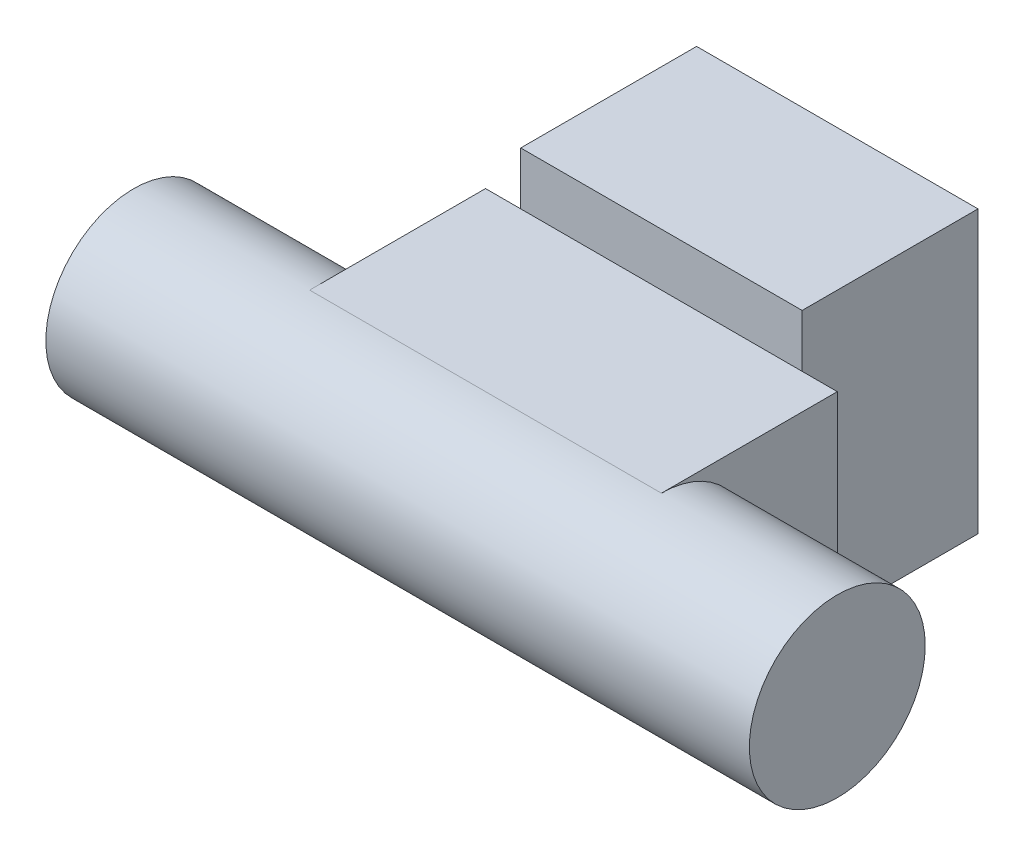
ISO-10303-21;
HEADER;
FILE_DESCRIPTION(('STEP AP214'),'2;1');
FILE_NAME('part.step','',(''),(''),'','','');
FILE_SCHEMA(('AUTOMOTIVE_DESIGN { 1 0 10303 214 1 1 1 1 }'));
ENDSEC;
DATA;
#1=APPLICATION_CONTEXT('core data for automotive mechanical design processes');
#2=APPLICATION_PROTOCOL_DEFINITION('international standard','automotive_design',2000,#1);
#3=PRODUCT_CONTEXT('',#1,'mechanical');
#4=PRODUCT('Part','Part','',(#3));
#5=PRODUCT_RELATED_PRODUCT_CATEGORY('part','',(#4));
#6=PRODUCT_DEFINITION_FORMATION('','',#4);
#7=PRODUCT_DEFINITION_CONTEXT('part definition',#1,'design');
#8=PRODUCT_DEFINITION('design','',#6,#7);
#9=PRODUCT_DEFINITION_SHAPE('','',#8);
#10=(LENGTH_UNIT() NAMED_UNIT(*) SI_UNIT(.MILLI.,.METRE.));
#11=(NAMED_UNIT(*) PLANE_ANGLE_UNIT() SI_UNIT($,.RADIAN.));
#12=(NAMED_UNIT(*) SI_UNIT($,.STERADIAN.) SOLID_ANGLE_UNIT());
#13=UNCERTAINTY_MEASURE_WITH_UNIT(LENGTH_MEASURE(1.E-05),#10,'distance_accuracy_value','');
#14=(GEOMETRIC_REPRESENTATION_CONTEXT(3) GLOBAL_UNCERTAINTY_ASSIGNED_CONTEXT((#13)) GLOBAL_UNIT_ASSIGNED_CONTEXT((#10,
#11,#12)) REPRESENTATION_CONTEXT('',''));
#15=CARTESIAN_POINT('',(0.,0.,0.));
#16=DIRECTION('',(0.,0.,1.));
#17=DIRECTION('',(1.,0.,0.));
#18=AXIS2_PLACEMENT_3D('',#15,#16,#17);
#19=CARTESIAN_POINT('',(0.,0.,0.));
#20=DIRECTION('',(0.,0.,1.));
#21=DIRECTION('',(1.,0.,0.));
#22=AXIS2_PLACEMENT_3D('',#19,#20,#21);
#23=PLANE('',#22);
#24=DIRECTION('',(0.,-1.,0.));
#25=VECTOR('',#24,1.);
#26=CARTESIAN_POINT('',(8.,3.,0.));
#27=LINE('',#26,#25);
#28=CARTESIAN_POINT('',(8.,0.,0.));
#29=VERTEX_POINT('',#28);
#30=CARTESIAN_POINT('',(8.,-10.,0.));
#31=VERTEX_POINT('',#30);
#32=EDGE_CURVE('E11',#29,#31,#27,.T.);
#33=ORIENTED_EDGE('',*,*,#32,.F.);
#34=DIRECTION('',(-1.,0.,0.));
#35=VECTOR('',#34,1.);
#36=CARTESIAN_POINT('',(0.,0.,0.));
#37=LINE('',#36,#35);
#38=CARTESIAN_POINT('',(10.,0.,0.));
#39=VERTEX_POINT('',#38);
#40=EDGE_CURVE('E169',#39,#29,#37,.T.);
#41=ORIENTED_EDGE('',*,*,#40,.F.);
#42=DIRECTION('',(0.,1.,0.));
#43=VECTOR('',#42,1.);
#44=CARTESIAN_POINT('',(10.,0.,0.));
#45=LINE('',#44,#43);
#46=CARTESIAN_POINT('',(10.,-10.,0.));
#47=VERTEX_POINT('',#46);
#48=EDGE_CURVE('E175',#47,#39,#45,.T.);
#49=ORIENTED_EDGE('',*,*,#48,.F.);
#50=DIRECTION('',(1.,0.,0.));
#51=VECTOR('',#50,1.);
#52=CARTESIAN_POINT('',(0.,-10.,0.));
#53=LINE('',#52,#51);
#54=EDGE_CURVE('E57',#31,#47,#53,.T.);
#55=ORIENTED_EDGE('',*,*,#54,.F.);
#56=EDGE_LOOP('',(#33,#41,#49,#55));
#57=FACE_BOUND('',#56,.T.);
#58=ADVANCED_FACE('F35',(#57),#23,.F.);
#59=DIRECTION('',(0.,1.,0.));
#60=VECTOR('',#59,1.);
#61=CARTESIAN_POINT('',(-8.,3.,0.));
#62=LINE('',#61,#60);
#63=CARTESIAN_POINT('',(-8.,-10.,0.));
#64=VERTEX_POINT('',#63);
#65=CARTESIAN_POINT('',(-8.,0.,0.));
#66=VERTEX_POINT('',#65);
#67=EDGE_CURVE('E44',#64,#66,#62,.T.);
#68=ORIENTED_EDGE('',*,*,#67,.F.);
#69=CARTESIAN_POINT('',(-10.,-10.,0.));
#70=VERTEX_POINT('',#69);
#71=EDGE_CURVE('E172',#70,#64,#53,.T.);
#72=ORIENTED_EDGE('',*,*,#71,.F.);
#73=DIRECTION('',(0.,1.,0.));
#74=VECTOR('',#73,1.);
#75=CARTESIAN_POINT('',(-10.,0.,0.));
#76=LINE('',#75,#74);
#77=CARTESIAN_POINT('',(-10.,0.,0.));
#78=VERTEX_POINT('',#77);
#79=EDGE_CURVE('E150',#70,#78,#76,.T.);
#80=ORIENTED_EDGE('',*,*,#79,.T.);
#81=EDGE_CURVE('E178',#66,#78,#37,.T.);
#82=ORIENTED_EDGE('',*,*,#81,.F.);
#83=EDGE_LOOP('',(#68,#72,#80,#82));
#84=FACE_BOUND('',#83,.T.);
#85=ADVANCED_FACE('F250',(#84),#23,.F.);
#86=CARTESIAN_POINT('',(10.,0.,10.));
#87=DIRECTION('',(-1.,0.,0.));
#88=DIRECTION('',(0.,-1.,0.));
#89=AXIS2_PLACEMENT_3D('',#86,#87,#88);
#90=PLANE('',#89);
#91=CARTESIAN_POINT('',(10.,-5.,10.));
#92=DIRECTION('',(-1.,0.,0.));
#93=DIRECTION('',(0.,-1.,0.));
#94=AXIS2_PLACEMENT_3D('',#91,#92,#93);
#95=CIRCLE('',#94,5.);
#96=CARTESIAN_POINT('',(10.,-10.,10.));
#97=VERTEX_POINT('',#96);
#98=CARTESIAN_POINT('',(10.,0.,10.));
#99=VERTEX_POINT('',#98);
#100=EDGE_CURVE('E162',#97,#99,#95,.F.);
#101=ORIENTED_EDGE('',*,*,#100,.F.);
#102=DIRECTION('',(0.,0.,-1.));
#103=VECTOR('',#102,1.);
#104=CARTESIAN_POINT('',(10.,-10.,10.));
#105=LINE('',#104,#103);
#106=EDGE_CURVE('E39',#97,#47,#105,.T.);
#107=ORIENTED_EDGE('',*,*,#106,.T.);
#108=ORIENTED_EDGE('',*,*,#48,.T.);
#109=DIRECTION('',(0.,0.,-1.));
#110=VECTOR('',#109,1.);
#111=CARTESIAN_POINT('',(10.,0.,10.));
#112=LINE('',#111,#110);
#113=EDGE_CURVE('E171',#99,#39,#112,.T.);
#114=ORIENTED_EDGE('',*,*,#113,.F.);
#115=EDGE_LOOP('',(#101,#107,#108,#114));
#116=FACE_BOUND('',#115,.T.);
#117=ADVANCED_FACE('F255',(#116),#90,.F.);
#118=CARTESIAN_POINT('',(0.,-10.,10.));
#119=DIRECTION('',(0.,1.,0.));
#120=DIRECTION('',(0.,0.,1.));
#121=AXIS2_PLACEMENT_3D('',#118,#119,#120);
#122=PLANE('',#121);
#123=ORIENTED_EDGE('',*,*,#71,.T.);
#124=EDGE_CURVE('E176',#64,#31,#53,.T.);
#125=ORIENTED_EDGE('',*,*,#124,.T.);
#126=ORIENTED_EDGE('',*,*,#54,.T.);
#127=ORIENTED_EDGE('',*,*,#106,.F.);
#128=DIRECTION('',(1.,0.,0.));
#129=VECTOR('',#128,1.);
#130=CARTESIAN_POINT('',(0.,-10.,10.));
#131=LINE('',#130,#129);
#132=CARTESIAN_POINT('',(-10.,-10.,10.));
#133=VERTEX_POINT('',#132);
#134=EDGE_CURVE('E165',#133,#97,#131,.T.);
#135=ORIENTED_EDGE('',*,*,#134,.F.);
#136=DIRECTION('',(0.,0.,-1.));
#137=VECTOR('',#136,1.);
#138=CARTESIAN_POINT('',(-10.,-10.,10.));
#139=LINE('',#138,#137);
#140=EDGE_CURVE('E153',#133,#70,#139,.T.);
#141=ORIENTED_EDGE('',*,*,#140,.T.);
#142=EDGE_LOOP('',(#123,#125,#126,#127,#135,#141));
#143=FACE_BOUND('',#142,.T.);
#144=ADVANCED_FACE('F37',(#143),#122,.F.);
#145=CARTESIAN_POINT('',(0.,0.,10.));
#146=DIRECTION('',(0.,-1.,0.));
#147=DIRECTION('',(0.,0.,-1.));
#148=AXIS2_PLACEMENT_3D('',#145,#146,#147);
#149=PLANE('',#148);
#150=ORIENTED_EDGE('',*,*,#40,.T.);
#151=EDGE_CURVE('E179',#29,#66,#37,.T.);
#152=ORIENTED_EDGE('',*,*,#151,.T.);
#153=ORIENTED_EDGE('',*,*,#81,.T.);
#154=DIRECTION('',(0.,0.,-1.));
#155=VECTOR('',#154,1.);
#156=CARTESIAN_POINT('',(-10.,0.,10.));
#157=LINE('',#156,#155);
#158=CARTESIAN_POINT('',(-10.,0.,10.));
#159=VERTEX_POINT('',#158);
#160=EDGE_CURVE('E156',#159,#78,#157,.T.);
#161=ORIENTED_EDGE('',*,*,#160,.F.);
#162=DIRECTION('',(-1.,0.,0.));
#163=VECTOR('',#162,1.);
#164=CARTESIAN_POINT('',(0.,0.,10.));
#165=LINE('',#164,#163);
#166=EDGE_CURVE('E168',#99,#159,#165,.T.);
#167=ORIENTED_EDGE('',*,*,#166,.F.);
#168=ORIENTED_EDGE('',*,*,#113,.T.);
#169=EDGE_LOOP('',(#150,#152,#153,#161,#167,#168));
#170=FACE_BOUND('',#169,.T.);
#171=ADVANCED_FACE('F261',(#170),#149,.F.);
#172=CARTESIAN_POINT('',(20.,-5.,10.));
#173=DIRECTION('',(-1.,0.,0.));
#174=DIRECTION('',(0.,0.,1.));
#175=AXIS2_PLACEMENT_3D('',#172,#173,#174);
#176=CYLINDRICAL_SURFACE('',#175,5.);
#177=ORIENTED_EDGE('',*,*,#166,.T.);
#178=CARTESIAN_POINT('',(-10.,-5.,10.));
#179=DIRECTION('',(-1.,0.,0.));
#180=DIRECTION('',(0.,-1.,0.));
#181=AXIS2_PLACEMENT_3D('',#178,#179,#180);
#182=CIRCLE('',#181,5.);
#183=EDGE_CURVE('E142',#159,#133,#182,.T.);
#184=ORIENTED_EDGE('',*,*,#183,.T.);
#185=ORIENTED_EDGE('',*,*,#134,.T.);
#186=ORIENTED_EDGE('',*,*,#100,.T.);
#187=EDGE_LOOP('',(#177,#184,#185,#186));
#188=FACE_BOUND('',#187,.T.);
#189=CARTESIAN_POINT('',(20.,-5.,10.));
#190=DIRECTION('',(1.,0.,0.));
#191=DIRECTION('',(0.,0.,-1.));
#192=AXIS2_PLACEMENT_3D('',#189,#190,#191);
#193=CIRCLE('',#192,5.);
#194=CARTESIAN_POINT('',(20.,-5.,5.));
#195=VERTEX_POINT('',#194);
#196=EDGE_CURVE('E159',#195,#195,#193,.T.);
#197=ORIENTED_EDGE('',*,*,#196,.F.);
#198=EDGE_LOOP('',(#197));
#199=FACE_BOUND('',#198,.T.);
#200=CARTESIAN_POINT('',(-20.,-5.,10.));
#201=DIRECTION('',(1.,0.,0.));
#202=DIRECTION('',(0.,0.,-1.));
#203=AXIS2_PLACEMENT_3D('',#200,#201,#202);
#204=CIRCLE('',#203,5.);
#205=CARTESIAN_POINT('',(-20.,-5.,5.));
#206=VERTEX_POINT('',#205);
#207=EDGE_CURVE('E139',#206,#206,#204,.T.);
#208=ORIENTED_EDGE('',*,*,#207,.T.);
#209=EDGE_LOOP('',(#208));
#210=FACE_BOUND('',#209,.T.);
#211=ADVANCED_FACE('F259',(#188,#199,#210),#176,.T.);
#212=CARTESIAN_POINT('',(20.,-5.,10.));
#213=DIRECTION('',(1.,0.,0.));
#214=DIRECTION('',(0.,0.,-1.));
#215=AXIS2_PLACEMENT_3D('',#212,#213,#214);
#216=PLANE('',#215);
#217=ORIENTED_EDGE('',*,*,#196,.T.);
#218=EDGE_LOOP('',(#217));
#219=FACE_BOUND('',#218,.T.);
#220=ADVANCED_FACE('F298',(#219),#216,.T.);
#221=CARTESIAN_POINT('',(-10.,0.,10.));
#222=DIRECTION('',(-1.,0.,0.));
#223=DIRECTION('',(0.,-1.,0.));
#224=AXIS2_PLACEMENT_3D('',#221,#222,#223);
#225=PLANE('',#224);
#226=ORIENTED_EDGE('',*,*,#183,.F.);
#227=ORIENTED_EDGE('',*,*,#160,.T.);
#228=ORIENTED_EDGE('',*,*,#79,.F.);
#229=ORIENTED_EDGE('',*,*,#140,.F.);
#230=EDGE_LOOP('',(#226,#227,#228,#229));
#231=FACE_BOUND('',#230,.T.);
#232=ADVANCED_FACE('F275',(#231),#225,.T.);
#233=CARTESIAN_POINT('',(-20.,-5.,10.));
#234=DIRECTION('',(-1.,0.,0.));
#235=DIRECTION('',(0.,0.,-1.));
#236=AXIS2_PLACEMENT_3D('',#233,#234,#235);
#237=PLANE('',#236);
#238=ORIENTED_EDGE('',*,*,#207,.F.);
#239=EDGE_LOOP('',(#238));
#240=FACE_BOUND('',#239,.T.);
#241=ADVANCED_FACE('F293',(#240),#237,.T.);
#242=CARTESIAN_POINT('',(0.,0.,0.));
#243=DIRECTION('',(0.,0.,-1.));
#244=DIRECTION('',(-1.,0.,0.));
#245=AXIS2_PLACEMENT_3D('',#242,#243,#244);
#246=PLANE('',#245);
#247=ORIENTED_EDGE('',*,*,#124,.F.);
#248=CARTESIAN_POINT('',(-8.,-13.,0.));
#249=VERTEX_POINT('',#248);
#250=EDGE_CURVE('E188',#249,#64,#62,.T.);
#251=ORIENTED_EDGE('',*,*,#250,.F.);
#252=DIRECTION('',(-1.,0.,0.));
#253=VECTOR('',#252,1.);
#254=CARTESIAN_POINT('',(8.,-13.,0.));
#255=LINE('',#254,#253);
#256=CARTESIAN_POINT('',(8.,-13.,0.));
#257=VERTEX_POINT('',#256);
#258=EDGE_CURVE('E194',#257,#249,#255,.T.);
#259=ORIENTED_EDGE('',*,*,#258,.F.);
#260=EDGE_CURVE('E47',#31,#257,#27,.T.);
#261=ORIENTED_EDGE('',*,*,#260,.F.);
#262=EDGE_LOOP('',(#247,#251,#259,#261));
#263=FACE_BOUND('',#262,.T.);
#264=ADVANCED_FACE('F245',(#263),#246,.F.);
#265=CARTESIAN_POINT('',(8.,3.,-10.));
#266=DIRECTION('',(-1.,0.,0.));
#267=DIRECTION('',(0.,-1.,0.));
#268=AXIS2_PLACEMENT_3D('',#265,#266,#267);
#269=PLANE('',#268);
#270=CARTESIAN_POINT('',(8.,3.,0.));
#271=VERTEX_POINT('',#270);
#272=EDGE_CURVE('E46',#271,#29,#27,.T.);
#273=ORIENTED_EDGE('',*,*,#272,.T.);
#274=ORIENTED_EDGE('',*,*,#32,.T.);
#275=ORIENTED_EDGE('',*,*,#260,.T.);
#276=DIRECTION('',(0.,0.,1.));
#277=VECTOR('',#276,1.);
#278=CARTESIAN_POINT('',(8.,-13.,-10.));
#279=LINE('',#278,#277);
#280=CARTESIAN_POINT('',(8.,-13.,-10.));
#281=VERTEX_POINT('',#280);
#282=EDGE_CURVE('E118',#281,#257,#279,.T.);
#283=ORIENTED_EDGE('',*,*,#282,.F.);
#284=DIRECTION('',(0.,-1.,0.));
#285=VECTOR('',#284,1.);
#286=CARTESIAN_POINT('',(8.,3.,-10.));
#287=LINE('',#286,#285);
#288=CARTESIAN_POINT('',(8.,3.,-10.));
#289=VERTEX_POINT('',#288);
#290=EDGE_CURVE('E124',#289,#281,#287,.T.);
#291=ORIENTED_EDGE('',*,*,#290,.F.);
#292=DIRECTION('',(0.,0.,1.));
#293=VECTOR('',#292,1.);
#294=CARTESIAN_POINT('',(8.,3.,-10.));
#295=LINE('',#294,#293);
#296=EDGE_CURVE('E200',#289,#271,#295,.T.);
#297=ORIENTED_EDGE('',*,*,#296,.T.);
#298=EDGE_LOOP('',(#273,#274,#275,#283,#291,#297));
#299=FACE_BOUND('',#298,.T.);
#300=ADVANCED_FACE('F136',(#299),#269,.F.);
#301=CARTESIAN_POINT('',(8.,-13.,-10.));
#302=DIRECTION('',(0.,1.,0.));
#303=DIRECTION('',(-1.,0.,0.));
#304=AXIS2_PLACEMENT_3D('',#301,#302,#303);
#305=PLANE('',#304);
#306=ORIENTED_EDGE('',*,*,#258,.T.);
#307=DIRECTION('',(0.,0.,1.));
#308=VECTOR('',#307,1.);
#309=CARTESIAN_POINT('',(-8.,-13.,-10.));
#310=LINE('',#309,#308);
#311=CARTESIAN_POINT('',(-8.,-13.,-10.));
#312=VERTEX_POINT('',#311);
#313=EDGE_CURVE('E120',#312,#249,#310,.T.);
#314=ORIENTED_EDGE('',*,*,#313,.F.);
#315=DIRECTION('',(-1.,0.,0.));
#316=VECTOR('',#315,1.);
#317=CARTESIAN_POINT('',(8.,-13.,-10.));
#318=LINE('',#317,#316);
#319=EDGE_CURVE('E114',#281,#312,#318,.T.);
#320=ORIENTED_EDGE('',*,*,#319,.F.);
#321=ORIENTED_EDGE('',*,*,#282,.T.);
#322=EDGE_LOOP('',(#306,#314,#320,#321));
#323=FACE_BOUND('',#322,.T.);
#324=ADVANCED_FACE('F116',(#323),#305,.F.);
#325=CARTESIAN_POINT('',(-8.,3.,-10.));
#326=DIRECTION('',(1.,0.,0.));
#327=DIRECTION('',(0.,1.,0.));
#328=AXIS2_PLACEMENT_3D('',#325,#326,#327);
#329=PLANE('',#328);
#330=ORIENTED_EDGE('',*,*,#250,.T.);
#331=ORIENTED_EDGE('',*,*,#67,.T.);
#332=CARTESIAN_POINT('',(-8.,3.,0.));
#333=VERTEX_POINT('',#332);
#334=EDGE_CURVE('E189',#66,#333,#62,.T.);
#335=ORIENTED_EDGE('',*,*,#334,.T.);
#336=DIRECTION('',(0.,0.,1.));
#337=VECTOR('',#336,1.);
#338=CARTESIAN_POINT('',(-8.,3.,-10.));
#339=LINE('',#338,#337);
#340=CARTESIAN_POINT('',(-8.,3.,-10.));
#341=VERTEX_POINT('',#340);
#342=EDGE_CURVE('E144',#341,#333,#339,.T.);
#343=ORIENTED_EDGE('',*,*,#342,.F.);
#344=DIRECTION('',(0.,1.,0.));
#345=VECTOR('',#344,1.);
#346=CARTESIAN_POINT('',(-8.,3.,-10.));
#347=LINE('',#346,#345);
#348=EDGE_CURVE('E123',#312,#341,#347,.T.);
#349=ORIENTED_EDGE('',*,*,#348,.F.);
#350=ORIENTED_EDGE('',*,*,#313,.T.);
#351=EDGE_LOOP('',(#330,#331,#335,#343,#349,#350));
#352=FACE_BOUND('',#351,.T.);
#353=ADVANCED_FACE('F246',(#352),#329,.F.);
#354=CARTESIAN_POINT('',(8.,3.,-10.));
#355=DIRECTION('',(0.,-1.,0.));
#356=DIRECTION('',(1.,0.,0.));
#357=AXIS2_PLACEMENT_3D('',#354,#355,#356);
#358=PLANE('',#357);
#359=DIRECTION('',(1.,0.,0.));
#360=VECTOR('',#359,1.);
#361=CARTESIAN_POINT('',(8.,3.,0.));
#362=LINE('',#361,#360);
#363=EDGE_CURVE('E133',#333,#271,#362,.T.);
#364=ORIENTED_EDGE('',*,*,#363,.T.);
#365=ORIENTED_EDGE('',*,*,#296,.F.);
#366=DIRECTION('',(1.,0.,0.));
#367=VECTOR('',#366,1.);
#368=CARTESIAN_POINT('',(8.,3.,-10.));
#369=LINE('',#368,#367);
#370=EDGE_CURVE('E129',#341,#289,#369,.T.);
#371=ORIENTED_EDGE('',*,*,#370,.F.);
#372=ORIENTED_EDGE('',*,*,#342,.T.);
#373=EDGE_LOOP('',(#364,#365,#371,#372));
#374=FACE_BOUND('',#373,.T.);
#375=ADVANCED_FACE('F237',(#374),#358,.F.);
#376=CARTESIAN_POINT('',(0.,0.,-10.));
#377=DIRECTION('',(0.,0.,-1.));
#378=DIRECTION('',(-1.,0.,0.));
#379=AXIS2_PLACEMENT_3D('',#376,#377,#378);
#380=PLANE('',#379);
#381=CARTESIAN_POINT('',(0.,-5.,-10.));
#382=DIRECTION('',(0.,0.,-1.));
#383=DIRECTION('',(-1.,0.,0.));
#384=AXIS2_PLACEMENT_3D('',#381,#382,#383);
#385=CIRCLE('',#384,5.);
#386=CARTESIAN_POINT('',(-5.,-5.,-10.));
#387=VERTEX_POINT('',#386);
#388=EDGE_CURVE('E202',#387,#387,#385,.T.);
#389=ORIENTED_EDGE('',*,*,#388,.F.);
#390=EDGE_LOOP('',(#389));
#391=FACE_BOUND('',#390,.T.);
#392=ORIENTED_EDGE('',*,*,#290,.T.);
#393=ORIENTED_EDGE('',*,*,#319,.T.);
#394=ORIENTED_EDGE('',*,*,#348,.T.);
#395=ORIENTED_EDGE('',*,*,#370,.T.);
#396=EDGE_LOOP('',(#392,#393,#394,#395));
#397=FACE_BOUND('',#396,.T.);
#398=ADVANCED_FACE('F127',(#391,#397),#380,.T.);
#399=ORIENTED_EDGE('',*,*,#151,.F.);
#400=ORIENTED_EDGE('',*,*,#272,.F.);
#401=ORIENTED_EDGE('',*,*,#363,.F.);
#402=ORIENTED_EDGE('',*,*,#334,.F.);
#403=EDGE_LOOP('',(#399,#400,#401,#402));
#404=FACE_BOUND('',#403,.T.);
#405=ADVANCED_FACE('F232',(#404),#246,.F.);
#406=CARTESIAN_POINT('',(0.,-5.,-6.));
#407=DIRECTION('',(0.,0.,-1.));
#408=DIRECTION('',(-1.,0.,0.));
#409=AXIS2_PLACEMENT_3D('',#406,#407,#408);
#410=CYLINDRICAL_SURFACE('',#409,5.);
#411=CARTESIAN_POINT('',(0.,-5.,-6.));
#412=DIRECTION('',(0.,0.,-1.));
#413=DIRECTION('',(-1.,0.,0.));
#414=AXIS2_PLACEMENT_3D('',#411,#412,#413);
#415=CIRCLE('',#414,5.);
#416=CARTESIAN_POINT('',(-5.,-5.,-6.));
#417=VERTEX_POINT('',#416);
#418=EDGE_CURVE('E205',#417,#417,#415,.F.);
#419=ORIENTED_EDGE('',*,*,#418,.T.);
#420=EDGE_LOOP('',(#419));
#421=FACE_BOUND('',#420,.T.);
#422=ORIENTED_EDGE('',*,*,#388,.T.);
#423=EDGE_LOOP('',(#422));
#424=FACE_BOUND('',#423,.T.);
#425=ADVANCED_FACE('F226',(#421,#424),#410,.F.);
#426=CARTESIAN_POINT('',(0.,-5.,-6.));
#427=DIRECTION('',(0.,0.,-1.));
#428=DIRECTION('',(-1.,0.,0.));
#429=AXIS2_PLACEMENT_3D('',#426,#427,#428);
#430=PLANE('',#429);
#431=CARTESIAN_POINT('',(0.,-5.,-6.));
#432=DIRECTION('',(0.,0.,-1.));
#433=DIRECTION('',(-1.,0.,0.));
#434=AXIS2_PLACEMENT_3D('',#431,#432,#433);
#435=CIRCLE('',#434,7.);
#436=CARTESIAN_POINT('',(-7.,-5.,-6.));
#437=VERTEX_POINT('',#436);
#438=EDGE_CURVE('E209',#437,#437,#435,.T.);
#439=ORIENTED_EDGE('',*,*,#438,.F.);
#440=EDGE_LOOP('',(#439));
#441=FACE_BOUND('',#440,.T.);
#442=ORIENTED_EDGE('',*,*,#418,.F.);
#443=EDGE_LOOP('',(#442));
#444=FACE_BOUND('',#443,.T.);
#445=ADVANCED_FACE('F220',(#441,#444),#430,.F.);
#446=CARTESIAN_POINT('',(0.,-5.,-2.));
#447=DIRECTION('',(0.,0.,-1.));
#448=DIRECTION('',(-1.,0.,0.));
#449=AXIS2_PLACEMENT_3D('',#446,#447,#448);
#450=CYLINDRICAL_SURFACE('',#449,7.);
#451=CARTESIAN_POINT('',(0.,-5.,-2.));
#452=DIRECTION('',(0.,0.,-1.));
#453=DIRECTION('',(-1.,0.,0.));
#454=AXIS2_PLACEMENT_3D('',#451,#452,#453);
#455=CIRCLE('',#454,7.);
#456=CARTESIAN_POINT('',(-7.,-5.,-2.));
#457=VERTEX_POINT('',#456);
#458=EDGE_CURVE('E208',#457,#457,#455,.T.);
#459=ORIENTED_EDGE('',*,*,#458,.F.);
#460=EDGE_LOOP('',(#459));
#461=FACE_BOUND('',#460,.T.);
#462=ORIENTED_EDGE('',*,*,#438,.T.);
#463=EDGE_LOOP('',(#462));
#464=FACE_BOUND('',#463,.T.);
#465=ADVANCED_FACE('F217',(#461,#464),#450,.F.);
#466=CARTESIAN_POINT('',(0.,-5.,-2.));
#467=DIRECTION('',(0.,0.,-1.));
#468=DIRECTION('',(-1.,0.,0.));
#469=AXIS2_PLACEMENT_3D('',#466,#467,#468);
#470=PLANE('',#469);
#471=ORIENTED_EDGE('',*,*,#458,.T.);
#472=EDGE_LOOP('',(#471));
#473=FACE_BOUND('',#472,.T.);
#474=ADVANCED_FACE('F215',(#473),#470,.T.);
#475=CLOSED_SHELL('',(#58,#85,#117,#144,#171,#211,#220,#232,#241,#264,#300,#324,#353,#375,#398,
#405,#425,#445,#465,#474));
#476=MANIFOLD_SOLID_BREP('B2',#475);
#477=ADVANCED_BREP_SHAPE_REPRESENTATION('',(#18,#476),#14);
#478=SHAPE_DEFINITION_REPRESENTATION(#9,#477);
ENDSEC;
END-ISO-10303-21;
